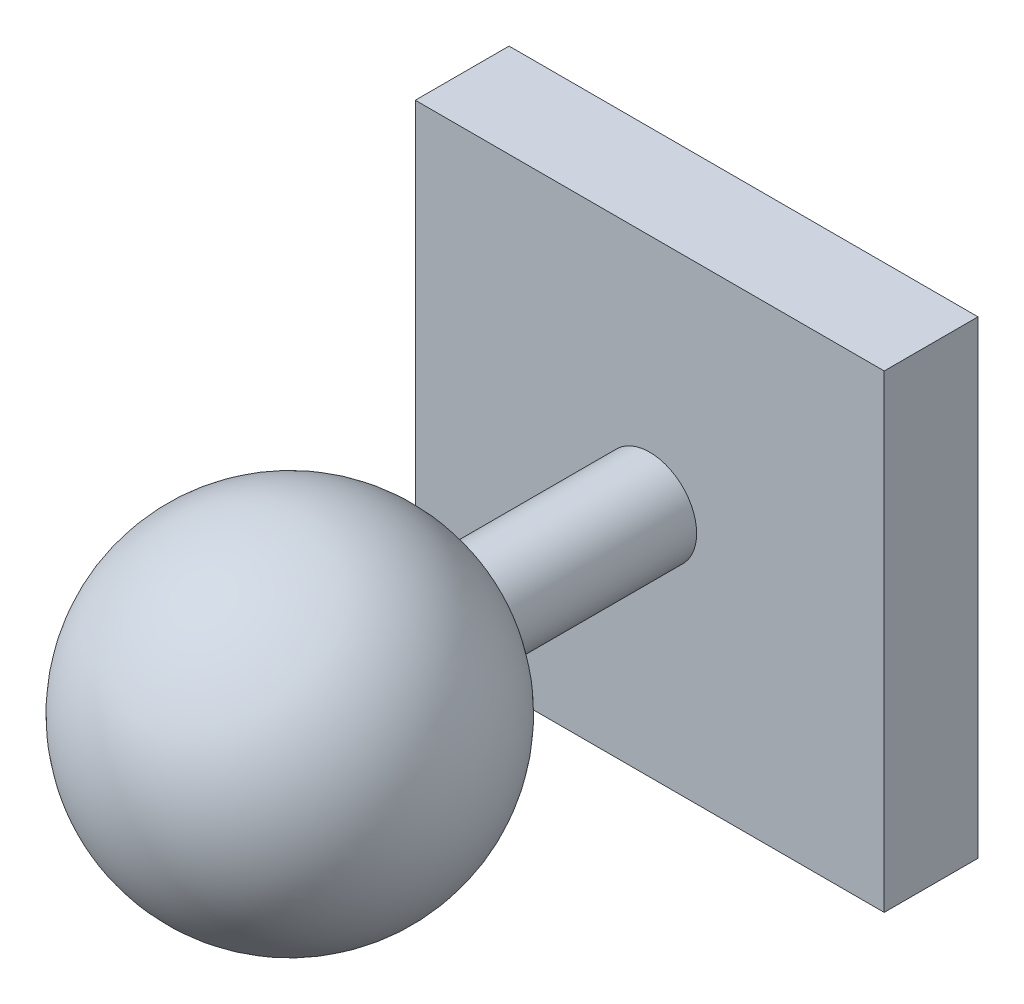
ISO-10303-21;
HEADER;
FILE_DESCRIPTION(('STEP AP214'),'2;1');
FILE_NAME('part.step','',(''),(''),'','','');
FILE_SCHEMA(('AUTOMOTIVE_DESIGN { 1 0 10303 214 1 1 1 1 }'));
ENDSEC;
DATA;
#1=APPLICATION_CONTEXT('core data for automotive mechanical design processes');
#2=APPLICATION_PROTOCOL_DEFINITION('international standard','automotive_design',2000,#1);
#3=PRODUCT_CONTEXT('',#1,'mechanical');
#4=PRODUCT('Part','Part','',(#3));
#5=PRODUCT_RELATED_PRODUCT_CATEGORY('part','',(#4));
#6=PRODUCT_DEFINITION_FORMATION('','',#4);
#7=PRODUCT_DEFINITION_CONTEXT('part definition',#1,'design');
#8=PRODUCT_DEFINITION('design','',#6,#7);
#9=PRODUCT_DEFINITION_SHAPE('','',#8);
#10=(LENGTH_UNIT() NAMED_UNIT(*) SI_UNIT(.MILLI.,.METRE.));
#11=(NAMED_UNIT(*) PLANE_ANGLE_UNIT() SI_UNIT($,.RADIAN.));
#12=(NAMED_UNIT(*) SI_UNIT($,.STERADIAN.) SOLID_ANGLE_UNIT());
#13=UNCERTAINTY_MEASURE_WITH_UNIT(LENGTH_MEASURE(1.E-05),#10,'distance_accuracy_value','');
#14=(GEOMETRIC_REPRESENTATION_CONTEXT(3) GLOBAL_UNCERTAINTY_ASSIGNED_CONTEXT((#13)) GLOBAL_UNIT_ASSIGNED_CONTEXT((#10,
#11,#12)) REPRESENTATION_CONTEXT('',''));
#15=CARTESIAN_POINT('',(0.,0.,0.));
#16=DIRECTION('',(0.,0.,1.));
#17=DIRECTION('',(1.,0.,0.));
#18=AXIS2_PLACEMENT_3D('',#15,#16,#17);
#19=CARTESIAN_POINT('',(0.,0.,48.3830677839276));
#20=DIRECTION('',(0.,0.,-1.));
#21=DIRECTION('',(-1.,0.,0.));
#22=AXIS2_PLACEMENT_3D('',#19,#20,#21);
#23=SPHERICAL_SURFACE('',#22,18.3830677839276);
#24=CARTESIAN_POINT('',(0.,0.,30.));
#25=VERTEX_POINT('',#24);
#26=VERTEX_LOOP('',#25);
#27=FACE_BOUND('',#26,.T.);
#28=ADVANCED_FACE('F37',(#27),#23,.T.);
#29=CLOSED_SHELL('',(#28));
#30=MANIFOLD_SOLID_BREP('B2',#29);
#31=CARTESIAN_POINT('',(-25.,25.,10.));
#32=DIRECTION('',(0.,0.,1.));
#33=DIRECTION('',(1.,0.,0.));
#34=AXIS2_PLACEMENT_3D('',#31,#32,#33);
#35=PLANE('',#34);
#36=DIRECTION('',(0.,-1.,0.));
#37=VECTOR('',#36,1.);
#38=CARTESIAN_POINT('',(-25.,-25.,10.));
#39=LINE('',#38,#37);
#40=CARTESIAN_POINT('',(-25.,25.,10.));
#41=VERTEX_POINT('',#40);
#42=CARTESIAN_POINT('',(-25.,-25.,10.));
#43=VERTEX_POINT('',#42);
#44=EDGE_CURVE('E102',#41,#43,#39,.T.);
#45=ORIENTED_EDGE('',*,*,#44,.T.);
#46=DIRECTION('',(1.,0.,0.));
#47=VECTOR('',#46,1.);
#48=CARTESIAN_POINT('',(25.,-25.,10.));
#49=LINE('',#48,#47);
#50=CARTESIAN_POINT('',(25.,-25.,10.));
#51=VERTEX_POINT('',#50);
#52=EDGE_CURVE('E97',#43,#51,#49,.T.);
#53=ORIENTED_EDGE('',*,*,#52,.T.);
#54=DIRECTION('',(0.,1.,0.));
#55=VECTOR('',#54,1.);
#56=CARTESIAN_POINT('',(25.,-25.,10.));
#57=LINE('',#56,#55);
#58=CARTESIAN_POINT('',(25.,25.,10.));
#59=VERTEX_POINT('',#58);
#60=EDGE_CURVE('E100',#51,#59,#57,.T.);
#61=ORIENTED_EDGE('',*,*,#60,.T.);
#62=DIRECTION('',(-1.,0.,0.));
#63=VECTOR('',#62,1.);
#64=CARTESIAN_POINT('',(25.,25.,10.));
#65=LINE('',#64,#63);
#66=EDGE_CURVE('E67',#59,#41,#65,.T.);
#67=ORIENTED_EDGE('',*,*,#66,.T.);
#68=EDGE_LOOP('',(#45,#53,#61,#67));
#69=FACE_BOUND('',#68,.T.);
#70=CARTESIAN_POINT('',(0.,0.,10.));
#71=DIRECTION('',(0.,0.,1.));
#72=DIRECTION('',(1.,0.,0.));
#73=AXIS2_PLACEMENT_3D('',#70,#71,#72);
#74=CIRCLE('',#73,5.);
#75=CARTESIAN_POINT('',(5.,0.,10.));
#76=VERTEX_POINT('',#75);
#77=EDGE_CURVE('E128',#76,#76,#74,.T.);
#78=ORIENTED_EDGE('',*,*,#77,.F.);
#79=EDGE_LOOP('',(#78));
#80=FACE_BOUND('',#79,.T.);
#81=ADVANCED_FACE('F50',(#69,#80),#35,.T.);
#82=CARTESIAN_POINT('',(-25.,-25.,10.));
#83=DIRECTION('',(1.,0.,0.));
#84=DIRECTION('',(0.,0.,-1.));
#85=AXIS2_PLACEMENT_3D('',#82,#83,#84);
#86=PLANE('',#85);
#87=DIRECTION('',(0.,-1.,0.));
#88=VECTOR('',#87,1.);
#89=CARTESIAN_POINT('',(-25.,-25.,0.));
#90=LINE('',#89,#88);
#91=CARTESIAN_POINT('',(-25.,25.,0.));
#92=VERTEX_POINT('',#91);
#93=CARTESIAN_POINT('',(-25.,-25.,0.));
#94=VERTEX_POINT('',#93);
#95=EDGE_CURVE('E114',#92,#94,#90,.T.);
#96=ORIENTED_EDGE('',*,*,#95,.T.);
#97=DIRECTION('',(0.,0.,-1.));
#98=VECTOR('',#97,1.);
#99=CARTESIAN_POINT('',(-25.,-25.,10.));
#100=LINE('',#99,#98);
#101=EDGE_CURVE('E35',#43,#94,#100,.T.);
#102=ORIENTED_EDGE('',*,*,#101,.F.);
#103=ORIENTED_EDGE('',*,*,#44,.F.);
#104=DIRECTION('',(0.,0.,-1.));
#105=VECTOR('',#104,1.);
#106=CARTESIAN_POINT('',(-25.,25.,10.));
#107=LINE('',#106,#105);
#108=EDGE_CURVE('E110',#41,#92,#107,.T.);
#109=ORIENTED_EDGE('',*,*,#108,.T.);
#110=EDGE_LOOP('',(#96,#102,#103,#109));
#111=FACE_BOUND('',#110,.T.);
#112=ADVANCED_FACE('F52',(#111),#86,.F.);
#113=CARTESIAN_POINT('',(25.,-25.,10.));
#114=DIRECTION('',(0.,1.,0.));
#115=DIRECTION('',(-1.,0.,0.));
#116=AXIS2_PLACEMENT_3D('',#113,#114,#115);
#117=PLANE('',#116);
#118=DIRECTION('',(1.,0.,0.));
#119=VECTOR('',#118,1.);
#120=CARTESIAN_POINT('',(25.,-25.,0.));
#121=LINE('',#120,#119);
#122=CARTESIAN_POINT('',(25.,-25.,0.));
#123=VERTEX_POINT('',#122);
#124=EDGE_CURVE('E106',#94,#123,#121,.T.);
#125=ORIENTED_EDGE('',*,*,#124,.T.);
#126=DIRECTION('',(0.,0.,-1.));
#127=VECTOR('',#126,1.);
#128=CARTESIAN_POINT('',(25.,-25.,10.));
#129=LINE('',#128,#127);
#130=EDGE_CURVE('E59',#51,#123,#129,.T.);
#131=ORIENTED_EDGE('',*,*,#130,.F.);
#132=ORIENTED_EDGE('',*,*,#52,.F.);
#133=ORIENTED_EDGE('',*,*,#101,.T.);
#134=EDGE_LOOP('',(#125,#131,#132,#133));
#135=FACE_BOUND('',#134,.T.);
#136=ADVANCED_FACE('F105',(#135),#117,.F.);
#137=CARTESIAN_POINT('',(25.,-25.,10.));
#138=DIRECTION('',(-1.,0.,0.));
#139=DIRECTION('',(0.,0.,1.));
#140=AXIS2_PLACEMENT_3D('',#137,#138,#139);
#141=PLANE('',#140);
#142=DIRECTION('',(0.,1.,0.));
#143=VECTOR('',#142,1.);
#144=CARTESIAN_POINT('',(25.,-25.,0.));
#145=LINE('',#144,#143);
#146=CARTESIAN_POINT('',(25.,25.,0.));
#147=VERTEX_POINT('',#146);
#148=EDGE_CURVE('E84',#123,#147,#145,.T.);
#149=ORIENTED_EDGE('',*,*,#148,.T.);
#150=DIRECTION('',(0.,0.,-1.));
#151=VECTOR('',#150,1.);
#152=CARTESIAN_POINT('',(25.,25.,10.));
#153=LINE('',#152,#151);
#154=EDGE_CURVE('E107',#59,#147,#153,.T.);
#155=ORIENTED_EDGE('',*,*,#154,.F.);
#156=ORIENTED_EDGE('',*,*,#60,.F.);
#157=ORIENTED_EDGE('',*,*,#130,.T.);
#158=EDGE_LOOP('',(#149,#155,#156,#157));
#159=FACE_BOUND('',#158,.T.);
#160=ADVANCED_FACE('F108',(#159),#141,.F.);
#161=CARTESIAN_POINT('',(25.,25.,10.));
#162=DIRECTION('',(0.,-1.,0.));
#163=DIRECTION('',(1.,0.,0.));
#164=AXIS2_PLACEMENT_3D('',#161,#162,#163);
#165=PLANE('',#164);
#166=DIRECTION('',(-1.,0.,0.));
#167=VECTOR('',#166,1.);
#168=CARTESIAN_POINT('',(25.,25.,0.));
#169=LINE('',#168,#167);
#170=EDGE_CURVE('E90',#147,#92,#169,.T.);
#171=ORIENTED_EDGE('',*,*,#170,.T.);
#172=ORIENTED_EDGE('',*,*,#108,.F.);
#173=ORIENTED_EDGE('',*,*,#66,.F.);
#174=ORIENTED_EDGE('',*,*,#154,.T.);
#175=EDGE_LOOP('',(#171,#172,#173,#174));
#176=FACE_BOUND('',#175,.T.);
#177=ADVANCED_FACE('F122',(#176),#165,.F.);
#178=CARTESIAN_POINT('',(-25.,25.,0.));
#179=DIRECTION('',(0.,0.,1.));
#180=DIRECTION('',(1.,0.,0.));
#181=AXIS2_PLACEMENT_3D('',#178,#179,#180);
#182=PLANE('',#181);
#183=CARTESIAN_POINT('',(0.,0.,0.));
#184=DIRECTION('',(0.,0.,-1.));
#185=DIRECTION('',(-1.,0.,0.));
#186=AXIS2_PLACEMENT_3D('',#183,#184,#185);
#187=CIRCLE('',#186,5.);
#188=CARTESIAN_POINT('',(-5.,0.,0.));
#189=VERTEX_POINT('',#188);
#190=EDGE_CURVE('E134',#189,#189,#187,.T.);
#191=ORIENTED_EDGE('',*,*,#190,.F.);
#192=EDGE_LOOP('',(#191));
#193=FACE_BOUND('',#192,.T.);
#194=ORIENTED_EDGE('',*,*,#95,.F.);
#195=ORIENTED_EDGE('',*,*,#170,.F.);
#196=ORIENTED_EDGE('',*,*,#148,.F.);
#197=ORIENTED_EDGE('',*,*,#124,.F.);
#198=EDGE_LOOP('',(#194,#195,#196,#197));
#199=FACE_BOUND('',#198,.T.);
#200=ADVANCED_FACE('F125',(#193,#199),#182,.F.);
#201=CARTESIAN_POINT('',(0.,0.,30.));
#202=DIRECTION('',(0.,0.,-1.));
#203=DIRECTION('',(-1.,0.,0.));
#204=AXIS2_PLACEMENT_3D('',#201,#202,#203);
#205=CYLINDRICAL_SURFACE('',#204,5.);
#206=CARTESIAN_POINT('',(0.,0.,30.));
#207=DIRECTION('',(0.,0.,1.));
#208=DIRECTION('',(1.,0.,0.));
#209=AXIS2_PLACEMENT_3D('',#206,#207,#208);
#210=CIRCLE('',#209,5.);
#211=CARTESIAN_POINT('',(5.,0.,30.));
#212=VERTEX_POINT('',#211);
#213=EDGE_CURVE('E117',#212,#212,#210,.T.);
#214=ORIENTED_EDGE('',*,*,#213,.F.);
#215=EDGE_LOOP('',(#214));
#216=FACE_BOUND('',#215,.T.);
#217=ORIENTED_EDGE('',*,*,#77,.T.);
#218=EDGE_LOOP('',(#217));
#219=FACE_BOUND('',#218,.T.);
#220=ADVANCED_FACE('F150',(#216,#219),#205,.T.);
#221=CARTESIAN_POINT('',(0.,0.,30.));
#222=DIRECTION('',(0.,0.,1.));
#223=DIRECTION('',(1.,0.,0.));
#224=AXIS2_PLACEMENT_3D('',#221,#222,#223);
#225=PLANE('',#224);
#226=ORIENTED_EDGE('',*,*,#213,.T.);
#227=EDGE_LOOP('',(#226));
#228=FACE_BOUND('',#227,.T.);
#229=ADVANCED_FACE('F145',(#228),#225,.T.);
#230=CARTESIAN_POINT('',(0.,0.,5.));
#231=DIRECTION('',(0.,0.,-1.));
#232=DIRECTION('',(-1.,0.,0.));
#233=AXIS2_PLACEMENT_3D('',#230,#231,#232);
#234=CYLINDRICAL_SURFACE('',#233,5.);
#235=CARTESIAN_POINT('',(0.,0.,5.));
#236=DIRECTION('',(0.,0.,-1.));
#237=DIRECTION('',(-1.,0.,0.));
#238=AXIS2_PLACEMENT_3D('',#235,#236,#237);
#239=CIRCLE('',#238,5.);
#240=CARTESIAN_POINT('',(-5.,0.,5.));
#241=VERTEX_POINT('',#240);
#242=EDGE_CURVE('E131',#241,#241,#239,.T.);
#243=ORIENTED_EDGE('',*,*,#242,.F.);
#244=EDGE_LOOP('',(#243));
#245=FACE_BOUND('',#244,.T.);
#246=ORIENTED_EDGE('',*,*,#190,.T.);
#247=EDGE_LOOP('',(#246));
#248=FACE_BOUND('',#247,.T.);
#249=ADVANCED_FACE('F142',(#245,#248),#234,.F.);
#250=CARTESIAN_POINT('',(0.,0.,5.));
#251=DIRECTION('',(0.,0.,-1.));
#252=DIRECTION('',(-1.,0.,0.));
#253=AXIS2_PLACEMENT_3D('',#250,#251,#252);
#254=PLANE('',#253);
#255=ORIENTED_EDGE('',*,*,#242,.T.);
#256=EDGE_LOOP('',(#255));
#257=FACE_BOUND('',#256,.T.);
#258=ADVANCED_FACE('F140',(#257),#254,.T.);
#259=CLOSED_SHELL('',(#81,#112,#136,#160,#177,#200,#220,#229,#249,#258));
#260=MANIFOLD_SOLID_BREP('B6',#259);
#261=ADVANCED_BREP_SHAPE_REPRESENTATION('',(#18,#30,#260),#14);
#262=SHAPE_DEFINITION_REPRESENTATION(#9,#261);
ENDSEC;
END-ISO-10303-21;
